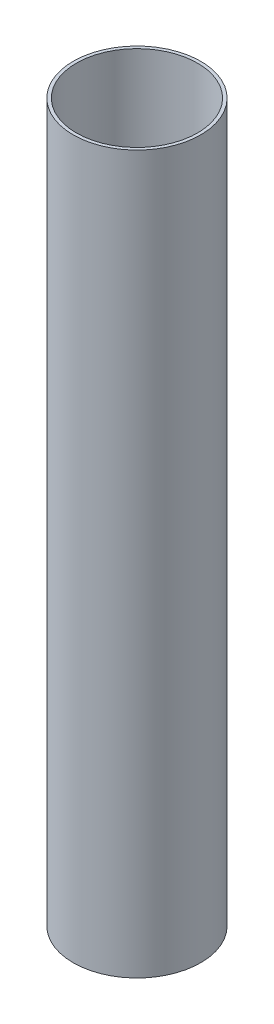
ISO-10303-21;
HEADER;
FILE_DESCRIPTION(('STEP AP214'),'2;1');
FILE_NAME('part.step','',(''),(''),'','','');
FILE_SCHEMA(('AUTOMOTIVE_DESIGN { 1 0 10303 214 1 1 1 1 }'));
ENDSEC;
DATA;
#1=APPLICATION_CONTEXT('core data for automotive mechanical design processes');
#2=APPLICATION_PROTOCOL_DEFINITION('international standard','automotive_design',2000,#1);
#3=PRODUCT_CONTEXT('',#1,'mechanical');
#4=PRODUCT('Part','Part','',(#3));
#5=PRODUCT_RELATED_PRODUCT_CATEGORY('part','',(#4));
#6=PRODUCT_DEFINITION_FORMATION('','',#4);
#7=PRODUCT_DEFINITION_CONTEXT('part definition',#1,'design');
#8=PRODUCT_DEFINITION('design','',#6,#7);
#9=PRODUCT_DEFINITION_SHAPE('','',#8);
#10=(LENGTH_UNIT() NAMED_UNIT(*) SI_UNIT(.MILLI.,.METRE.));
#11=(NAMED_UNIT(*) PLANE_ANGLE_UNIT() SI_UNIT($,.RADIAN.));
#12=(NAMED_UNIT(*) SI_UNIT($,.STERADIAN.) SOLID_ANGLE_UNIT());
#13=UNCERTAINTY_MEASURE_WITH_UNIT(LENGTH_MEASURE(1.E-05),#10,'distance_accuracy_value','');
#14=(GEOMETRIC_REPRESENTATION_CONTEXT(3) GLOBAL_UNCERTAINTY_ASSIGNED_CONTEXT((#13)) GLOBAL_UNIT_ASSIGNED_CONTEXT((#10,
#11,#12)) REPRESENTATION_CONTEXT('',''));
#15=CARTESIAN_POINT('',(0.,0.,0.));
#16=DIRECTION('',(0.,0.,1.));
#17=DIRECTION('',(1.,0.,0.));
#18=AXIS2_PLACEMENT_3D('',#15,#16,#17);
#19=CARTESIAN_POINT('',(0.,185.,0.));
#20=DIRECTION('',(0.,1.,0.));
#21=DIRECTION('',(0.,0.,1.));
#22=AXIS2_PLACEMENT_3D('',#19,#20,#21);
#23=PLANE('',#22);
#24=CARTESIAN_POINT('',(0.,185.,0.));
#25=DIRECTION('',(0.,1.,0.));
#26=DIRECTION('',(0.,0.,1.));
#27=AXIS2_PLACEMENT_3D('',#24,#25,#26);
#28=CIRCLE('',#27,32.9);
#29=CARTESIAN_POINT('',(0.,185.,32.9));
#30=VERTEX_POINT('',#29);
#31=EDGE_CURVE('E10',#30,#30,#28,.T.);
#32=ORIENTED_EDGE('',*,*,#31,.T.);
#33=EDGE_LOOP('',(#32));
#34=FACE_BOUND('',#33,.T.);
#35=CARTESIAN_POINT('',(0.,185.,0.));
#36=DIRECTION('',(0.,1.,0.));
#37=DIRECTION('',(0.,0.,1.));
#38=AXIS2_PLACEMENT_3D('',#35,#36,#37);
#39=CIRCLE('',#38,31.25);
#40=CARTESIAN_POINT('',(0.,185.,31.25));
#41=VERTEX_POINT('',#40);
#42=EDGE_CURVE('E42',#41,#41,#39,.T.);
#43=ORIENTED_EDGE('',*,*,#42,.F.);
#44=EDGE_LOOP('',(#43));
#45=FACE_BOUND('',#44,.T.);
#46=ADVANCED_FACE('F31',(#34,#45),#23,.T.);
#47=CARTESIAN_POINT('',(0.,-185.,0.));
#48=DIRECTION('',(0.,1.,0.));
#49=DIRECTION('',(0.,0.,1.));
#50=AXIS2_PLACEMENT_3D('',#47,#48,#49);
#51=PLANE('',#50);
#52=CARTESIAN_POINT('',(0.,-185.,0.));
#53=DIRECTION('',(0.,1.,0.));
#54=DIRECTION('',(0.,0.,1.));
#55=AXIS2_PLACEMENT_3D('',#52,#53,#54);
#56=CIRCLE('',#55,32.9);
#57=CARTESIAN_POINT('',(0.,-185.,32.9));
#58=VERTEX_POINT('',#57);
#59=EDGE_CURVE('E35',#58,#58,#56,.T.);
#60=ORIENTED_EDGE('',*,*,#59,.F.);
#61=EDGE_LOOP('',(#60));
#62=FACE_BOUND('',#61,.T.);
#63=CARTESIAN_POINT('',(0.,-185.,0.));
#64=DIRECTION('',(0.,1.,0.));
#65=DIRECTION('',(0.,0.,1.));
#66=AXIS2_PLACEMENT_3D('',#63,#64,#65);
#67=CIRCLE('',#66,31.25);
#68=CARTESIAN_POINT('',(0.,-185.,31.25));
#69=VERTEX_POINT('',#68);
#70=EDGE_CURVE('E44',#69,#69,#67,.T.);
#71=ORIENTED_EDGE('',*,*,#70,.T.);
#72=EDGE_LOOP('',(#71));
#73=FACE_BOUND('',#72,.T.);
#74=ADVANCED_FACE('F54',(#62,#73),#51,.F.);
#75=CARTESIAN_POINT('',(0.,185.,0.));
#76=DIRECTION('',(0.,-1.,0.));
#77=DIRECTION('',(0.,0.,-1.));
#78=AXIS2_PLACEMENT_3D('',#75,#76,#77);
#79=CYLINDRICAL_SURFACE('',#78,32.9);
#80=ORIENTED_EDGE('',*,*,#31,.F.);
#81=EDGE_LOOP('',(#80));
#82=FACE_BOUND('',#81,.T.);
#83=ORIENTED_EDGE('',*,*,#59,.T.);
#84=EDGE_LOOP('',(#83));
#85=FACE_BOUND('',#84,.T.);
#86=ADVANCED_FACE('F33',(#82,#85),#79,.T.);
#87=CARTESIAN_POINT('',(0.,185.,0.));
#88=DIRECTION('',(0.,-1.,0.));
#89=DIRECTION('',(0.,0.,-1.));
#90=AXIS2_PLACEMENT_3D('',#87,#88,#89);
#91=CYLINDRICAL_SURFACE('',#90,31.25);
#92=ORIENTED_EDGE('',*,*,#42,.T.);
#93=EDGE_LOOP('',(#92));
#94=FACE_BOUND('',#93,.T.);
#95=ORIENTED_EDGE('',*,*,#70,.F.);
#96=EDGE_LOOP('',(#95));
#97=FACE_BOUND('',#96,.T.);
#98=ADVANCED_FACE('F50',(#94,#97),#91,.F.);
#99=CLOSED_SHELL('',(#46,#74,#86,#98));
#100=MANIFOLD_SOLID_BREP('B2',#99);
#101=ADVANCED_BREP_SHAPE_REPRESENTATION('',(#18,#100),#14);
#102=SHAPE_DEFINITION_REPRESENTATION(#9,#101);
ENDSEC;
END-ISO-10303-21;
